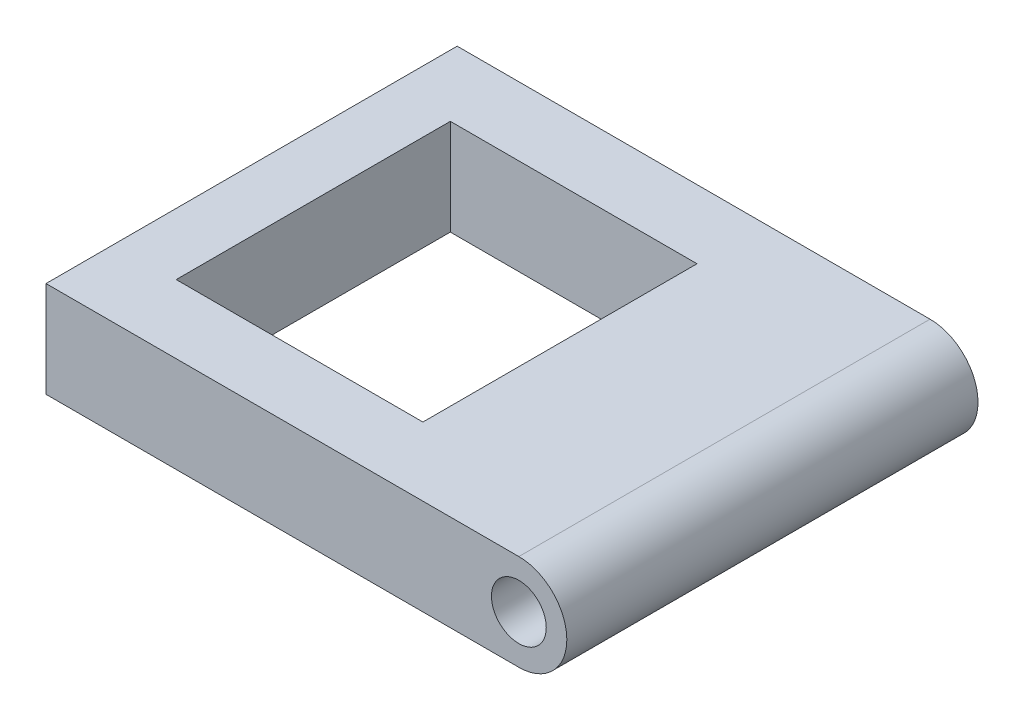
ISO-10303-21;
HEADER;
FILE_DESCRIPTION(('STEP AP214'),'2;1');
FILE_NAME('part.step','',(''),(''),'','','');
FILE_SCHEMA(('AUTOMOTIVE_DESIGN { 1 0 10303 214 1 1 1 1 }'));
ENDSEC;
DATA;
#1=APPLICATION_CONTEXT('core data for automotive mechanical design processes');
#2=APPLICATION_PROTOCOL_DEFINITION('international standard','automotive_design',2000,#1);
#3=PRODUCT_CONTEXT('',#1,'mechanical');
#4=PRODUCT('Part','Part','',(#3));
#5=PRODUCT_RELATED_PRODUCT_CATEGORY('part','',(#4));
#6=PRODUCT_DEFINITION_FORMATION('','',#4);
#7=PRODUCT_DEFINITION_CONTEXT('part definition',#1,'design');
#8=PRODUCT_DEFINITION('design','',#6,#7);
#9=PRODUCT_DEFINITION_SHAPE('','',#8);
#10=(LENGTH_UNIT() NAMED_UNIT(*) SI_UNIT(.MILLI.,.METRE.));
#11=(NAMED_UNIT(*) PLANE_ANGLE_UNIT() SI_UNIT($,.RADIAN.));
#12=(NAMED_UNIT(*) SI_UNIT($,.STERADIAN.) SOLID_ANGLE_UNIT());
#13=UNCERTAINTY_MEASURE_WITH_UNIT(LENGTH_MEASURE(1.E-05),#10,'distance_accuracy_value','');
#14=(GEOMETRIC_REPRESENTATION_CONTEXT(3) GLOBAL_UNCERTAINTY_ASSIGNED_CONTEXT((#13)) GLOBAL_UNIT_ASSIGNED_CONTEXT((#10,
#11,#12)) REPRESENTATION_CONTEXT('',''));
#15=CARTESIAN_POINT('',(0.,0.,0.));
#16=DIRECTION('',(0.,0.,1.));
#17=DIRECTION('',(1.,0.,0.));
#18=AXIS2_PLACEMENT_3D('',#15,#16,#17);
#19=CARTESIAN_POINT('',(0.,14.,0.));
#20=DIRECTION('',(0.,-1.,0.));
#21=DIRECTION('',(0.,0.,-1.));
#22=AXIS2_PLACEMENT_3D('',#19,#20,#21);
#23=PLANE('',#22);
#24=DIRECTION('',(0.,0.,1.));
#25=VECTOR('',#24,1.);
#26=CARTESIAN_POINT('',(0.,14.,0.));
#27=LINE('',#26,#25);
#28=CARTESIAN_POINT('',(0.,14.,-60.));
#29=VERTEX_POINT('',#28);
#30=CARTESIAN_POINT('',(0.,14.,0.));
#31=VERTEX_POINT('',#30);
#32=EDGE_CURVE('E126',#29,#31,#27,.T.);
#33=ORIENTED_EDGE('',*,*,#32,.T.);
#34=DIRECTION('',(1.,0.,0.));
#35=VECTOR('',#34,1.);
#36=CARTESIAN_POINT('',(0.,14.,0.));
#37=LINE('',#36,#35);
#38=CARTESIAN_POINT('',(69.,14.,0.));
#39=VERTEX_POINT('',#38);
#40=EDGE_CURVE('E194',#31,#39,#37,.T.);
#41=ORIENTED_EDGE('',*,*,#40,.T.);
#42=DIRECTION('',(0.,0.,1.));
#43=VECTOR('',#42,1.);
#44=CARTESIAN_POINT('',(69.,14.,-60.));
#45=LINE('',#44,#43);
#46=CARTESIAN_POINT('',(69.,14.,-60.));
#47=VERTEX_POINT('',#46);
#48=EDGE_CURVE('E137',#47,#39,#45,.T.);
#49=ORIENTED_EDGE('',*,*,#48,.F.);
#50=DIRECTION('',(-1.,0.,0.));
#51=VECTOR('',#50,1.);
#52=CARTESIAN_POINT('',(0.,14.,-60.));
#53=LINE('',#52,#51);
#54=EDGE_CURVE('E141',#47,#29,#53,.T.);
#55=ORIENTED_EDGE('',*,*,#54,.T.);
#56=EDGE_LOOP('',(#33,#41,#49,#55));
#57=FACE_BOUND('',#56,.T.);
#58=DIRECTION('',(1.,0.,0.));
#59=VECTOR('',#58,1.);
#60=CARTESIAN_POINT('',(45.,14.,-10.));
#61=LINE('',#60,#59);
#62=CARTESIAN_POINT('',(9.,14.,-10.));
#63=VERTEX_POINT('',#62);
#64=CARTESIAN_POINT('',(45.,14.,-10.));
#65=VERTEX_POINT('',#64);
#66=EDGE_CURVE('E154',#63,#65,#61,.T.);
#67=ORIENTED_EDGE('',*,*,#66,.F.);
#68=DIRECTION('',(0.,0.,1.));
#69=VECTOR('',#68,1.);
#70=CARTESIAN_POINT('',(9.,14.,-10.));
#71=LINE('',#70,#69);
#72=CARTESIAN_POINT('',(9.,14.,-50.));
#73=VERTEX_POINT('',#72);
#74=EDGE_CURVE('E164',#73,#63,#71,.T.);
#75=ORIENTED_EDGE('',*,*,#74,.F.);
#76=DIRECTION('',(-1.,0.,0.));
#77=VECTOR('',#76,1.);
#78=CARTESIAN_POINT('',(9.,14.,-50.));
#79=LINE('',#78,#77);
#80=CARTESIAN_POINT('',(45.,14.,-50.));
#81=VERTEX_POINT('',#80);
#82=EDGE_CURVE('E161',#81,#73,#79,.T.);
#83=ORIENTED_EDGE('',*,*,#82,.F.);
#84=DIRECTION('',(0.,0.,-1.));
#85=VECTOR('',#84,1.);
#86=CARTESIAN_POINT('',(45.,14.,-50.));
#87=LINE('',#86,#85);
#88=EDGE_CURVE('E157',#65,#81,#87,.T.);
#89=ORIENTED_EDGE('',*,*,#88,.F.);
#90=EDGE_LOOP('',(#67,#75,#83,#89));
#91=FACE_BOUND('',#90,.T.);
#92=ADVANCED_FACE('F45',(#57,#91),#23,.F.);
#93=CARTESIAN_POINT('',(0.,0.,0.));
#94=DIRECTION('',(0.,-1.,0.));
#95=DIRECTION('',(0.,0.,-1.));
#96=AXIS2_PLACEMENT_3D('',#93,#94,#95);
#97=PLANE('',#96);
#98=DIRECTION('',(0.,0.,1.));
#99=VECTOR('',#98,1.);
#100=CARTESIAN_POINT('',(0.,0.,0.));
#101=LINE('',#100,#99);
#102=CARTESIAN_POINT('',(0.,0.,-60.));
#103=VERTEX_POINT('',#102);
#104=CARTESIAN_POINT('',(0.,0.,0.));
#105=VERTEX_POINT('',#104);
#106=EDGE_CURVE('E120',#103,#105,#101,.T.);
#107=ORIENTED_EDGE('',*,*,#106,.F.);
#108=DIRECTION('',(-1.,0.,0.));
#109=VECTOR('',#108,1.);
#110=CARTESIAN_POINT('',(0.,0.,-60.));
#111=LINE('',#110,#109);
#112=CARTESIAN_POINT('',(69.,0.,-60.));
#113=VERTEX_POINT('',#112);
#114=EDGE_CURVE('E113',#113,#103,#111,.T.);
#115=ORIENTED_EDGE('',*,*,#114,.F.);
#116=DIRECTION('',(0.,0.,1.));
#117=VECTOR('',#116,1.);
#118=CARTESIAN_POINT('',(69.,0.,-60.));
#119=LINE('',#118,#117);
#120=CARTESIAN_POINT('',(69.,0.,0.));
#121=VERTEX_POINT('',#120);
#122=EDGE_CURVE('E117',#113,#121,#119,.T.);
#123=ORIENTED_EDGE('',*,*,#122,.T.);
#124=DIRECTION('',(1.,0.,0.));
#125=VECTOR('',#124,1.);
#126=CARTESIAN_POINT('',(0.,0.,0.));
#127=LINE('',#126,#125);
#128=EDGE_CURVE('E127',#105,#121,#127,.T.);
#129=ORIENTED_EDGE('',*,*,#128,.F.);
#130=EDGE_LOOP('',(#107,#115,#123,#129));
#131=FACE_BOUND('',#130,.T.);
#132=DIRECTION('',(0.,0.,1.));
#133=VECTOR('',#132,1.);
#134=CARTESIAN_POINT('',(9.,0.,-10.));
#135=LINE('',#134,#133);
#136=CARTESIAN_POINT('',(9.,0.,-50.));
#137=VERTEX_POINT('',#136);
#138=CARTESIAN_POINT('',(9.,0.,-10.));
#139=VERTEX_POINT('',#138);
#140=EDGE_CURVE('E158',#137,#139,#135,.T.);
#141=ORIENTED_EDGE('',*,*,#140,.T.);
#142=DIRECTION('',(1.,0.,0.));
#143=VECTOR('',#142,1.);
#144=CARTESIAN_POINT('',(45.,0.,-10.));
#145=LINE('',#144,#143);
#146=CARTESIAN_POINT('',(45.,0.,-10.));
#147=VERTEX_POINT('',#146);
#148=EDGE_CURVE('E69',#139,#147,#145,.T.);
#149=ORIENTED_EDGE('',*,*,#148,.T.);
#150=DIRECTION('',(0.,0.,-1.));
#151=VECTOR('',#150,1.);
#152=CARTESIAN_POINT('',(45.,0.,-50.));
#153=LINE('',#152,#151);
#154=CARTESIAN_POINT('',(45.,0.,-50.));
#155=VERTEX_POINT('',#154);
#156=EDGE_CURVE('E170',#147,#155,#153,.T.);
#157=ORIENTED_EDGE('',*,*,#156,.T.);
#158=DIRECTION('',(-1.,0.,0.));
#159=VECTOR('',#158,1.);
#160=CARTESIAN_POINT('',(9.,0.,-50.));
#161=LINE('',#160,#159);
#162=EDGE_CURVE('E174',#155,#137,#161,.T.);
#163=ORIENTED_EDGE('',*,*,#162,.T.);
#164=EDGE_LOOP('',(#141,#149,#157,#163));
#165=FACE_BOUND('',#164,.T.);
#166=ADVANCED_FACE('F115',(#131,#165),#97,.T.);
#167=CARTESIAN_POINT('',(0.,14.,0.));
#168=DIRECTION('',(1.,0.,0.));
#169=DIRECTION('',(0.,0.,-1.));
#170=AXIS2_PLACEMENT_3D('',#167,#168,#169);
#171=PLANE('',#170);
#172=ORIENTED_EDGE('',*,*,#106,.T.);
#173=DIRECTION('',(0.,-1.,0.));
#174=VECTOR('',#173,1.);
#175=CARTESIAN_POINT('',(0.,14.,0.));
#176=LINE('',#175,#174);
#177=EDGE_CURVE('E11',#31,#105,#176,.T.);
#178=ORIENTED_EDGE('',*,*,#177,.F.);
#179=ORIENTED_EDGE('',*,*,#32,.F.);
#180=DIRECTION('',(0.,-1.,0.));
#181=VECTOR('',#180,1.);
#182=CARTESIAN_POINT('',(0.,14.,-60.));
#183=LINE('',#182,#181);
#184=EDGE_CURVE('E54',#29,#103,#183,.T.);
#185=ORIENTED_EDGE('',*,*,#184,.T.);
#186=EDGE_LOOP('',(#172,#178,#179,#185));
#187=FACE_BOUND('',#186,.T.);
#188=ADVANCED_FACE('F47',(#187),#171,.F.);
#189=CARTESIAN_POINT('',(0.,14.,0.));
#190=DIRECTION('',(0.,0.,-1.));
#191=DIRECTION('',(-1.,0.,0.));
#192=AXIS2_PLACEMENT_3D('',#189,#190,#191);
#193=PLANE('',#192);
#194=ORIENTED_EDGE('',*,*,#128,.T.);
#195=CARTESIAN_POINT('',(69.,7.,0.));
#196=DIRECTION('',(0.,0.,1.));
#197=DIRECTION('',(1.,0.,0.));
#198=AXIS2_PLACEMENT_3D('',#195,#196,#197);
#199=CIRCLE('',#198,7.);
#200=EDGE_CURVE('E135',#121,#39,#199,.T.);
#201=ORIENTED_EDGE('',*,*,#200,.T.);
#202=ORIENTED_EDGE('',*,*,#40,.F.);
#203=ORIENTED_EDGE('',*,*,#177,.T.);
#204=EDGE_LOOP('',(#194,#201,#202,#203));
#205=FACE_BOUND('',#204,.T.);
#206=CARTESIAN_POINT('',(69.,7.,0.));
#207=DIRECTION('',(0.,0.,1.));
#208=DIRECTION('',(1.,0.,0.));
#209=AXIS2_PLACEMENT_3D('',#206,#207,#208);
#210=CIRCLE('',#209,4.00000000000001);
#211=CARTESIAN_POINT('',(73.,7.,0.));
#212=VERTEX_POINT('',#211);
#213=EDGE_CURVE('E149',#212,#212,#210,.T.);
#214=ORIENTED_EDGE('',*,*,#213,.F.);
#215=EDGE_LOOP('',(#214));
#216=FACE_BOUND('',#215,.T.);
#217=ADVANCED_FACE('F209',(#205,#216),#193,.F.);
#218=CARTESIAN_POINT('',(0.,14.,-60.));
#219=DIRECTION('',(0.,0.,1.));
#220=DIRECTION('',(1.,0.,0.));
#221=AXIS2_PLACEMENT_3D('',#218,#219,#220);
#222=PLANE('',#221);
#223=ORIENTED_EDGE('',*,*,#114,.T.);
#224=ORIENTED_EDGE('',*,*,#184,.F.);
#225=ORIENTED_EDGE('',*,*,#54,.F.);
#226=CARTESIAN_POINT('',(69.,7.,-60.));
#227=DIRECTION('',(0.,0.,1.));
#228=DIRECTION('',(1.,0.,0.));
#229=AXIS2_PLACEMENT_3D('',#226,#227,#228);
#230=CIRCLE('',#229,7.);
#231=EDGE_CURVE('E133',#113,#47,#230,.T.);
#232=ORIENTED_EDGE('',*,*,#231,.F.);
#233=EDGE_LOOP('',(#223,#224,#225,#232));
#234=FACE_BOUND('',#233,.T.);
#235=CARTESIAN_POINT('',(69.,7.,-60.));
#236=DIRECTION('',(0.,0.,1.));
#237=DIRECTION('',(1.,0.,0.));
#238=AXIS2_PLACEMENT_3D('',#235,#236,#237);
#239=CIRCLE('',#238,4.00000000000001);
#240=CARTESIAN_POINT('',(73.,7.,-60.));
#241=VERTEX_POINT('',#240);
#242=EDGE_CURVE('E146',#241,#241,#239,.T.);
#243=ORIENTED_EDGE('',*,*,#242,.T.);
#244=EDGE_LOOP('',(#243));
#245=FACE_BOUND('',#244,.T.);
#246=ADVANCED_FACE('F139',(#234,#245),#222,.F.);
#247=CARTESIAN_POINT('',(45.,14.,-10.));
#248=DIRECTION('',(0.,0.,-1.));
#249=DIRECTION('',(-1.,0.,0.));
#250=AXIS2_PLACEMENT_3D('',#247,#248,#249);
#251=PLANE('',#250);
#252=ORIENTED_EDGE('',*,*,#148,.F.);
#253=DIRECTION('',(0.,-1.,0.));
#254=VECTOR('',#253,1.);
#255=CARTESIAN_POINT('',(9.,14.,-10.));
#256=LINE('',#255,#254);
#257=EDGE_CURVE('E167',#63,#139,#256,.T.);
#258=ORIENTED_EDGE('',*,*,#257,.F.);
#259=ORIENTED_EDGE('',*,*,#66,.T.);
#260=DIRECTION('',(0.,-1.,0.));
#261=VECTOR('',#260,1.);
#262=CARTESIAN_POINT('',(45.,14.,-10.));
#263=LINE('',#262,#261);
#264=EDGE_CURVE('E188',#65,#147,#263,.T.);
#265=ORIENTED_EDGE('',*,*,#264,.T.);
#266=EDGE_LOOP('',(#252,#258,#259,#265));
#267=FACE_BOUND('',#266,.T.);
#268=ADVANCED_FACE('F236',(#267),#251,.T.);
#269=CARTESIAN_POINT('',(45.,14.,-50.));
#270=DIRECTION('',(-1.,0.,0.));
#271=DIRECTION('',(0.,0.,1.));
#272=AXIS2_PLACEMENT_3D('',#269,#270,#271);
#273=PLANE('',#272);
#274=ORIENTED_EDGE('',*,*,#156,.F.);
#275=ORIENTED_EDGE('',*,*,#264,.F.);
#276=ORIENTED_EDGE('',*,*,#88,.T.);
#277=DIRECTION('',(0.,-1.,0.));
#278=VECTOR('',#277,1.);
#279=CARTESIAN_POINT('',(45.,14.,-50.));
#280=LINE('',#279,#278);
#281=EDGE_CURVE('E185',#81,#155,#280,.T.);
#282=ORIENTED_EDGE('',*,*,#281,.T.);
#283=EDGE_LOOP('',(#274,#275,#276,#282));
#284=FACE_BOUND('',#283,.T.);
#285=ADVANCED_FACE('F243',(#284),#273,.T.);
#286=CARTESIAN_POINT('',(9.,14.,-50.));
#287=DIRECTION('',(0.,0.,1.));
#288=DIRECTION('',(1.,0.,0.));
#289=AXIS2_PLACEMENT_3D('',#286,#287,#288);
#290=PLANE('',#289);
#291=ORIENTED_EDGE('',*,*,#162,.F.);
#292=ORIENTED_EDGE('',*,*,#281,.F.);
#293=ORIENTED_EDGE('',*,*,#82,.T.);
#294=DIRECTION('',(0.,-1.,0.));
#295=VECTOR('',#294,1.);
#296=CARTESIAN_POINT('',(9.,14.,-50.));
#297=LINE('',#296,#295);
#298=EDGE_CURVE('E61',#73,#137,#297,.T.);
#299=ORIENTED_EDGE('',*,*,#298,.T.);
#300=EDGE_LOOP('',(#291,#292,#293,#299));
#301=FACE_BOUND('',#300,.T.);
#302=ADVANCED_FACE('F248',(#301),#290,.T.);
#303=CARTESIAN_POINT('',(9.,14.,-10.));
#304=DIRECTION('',(1.,0.,0.));
#305=DIRECTION('',(0.,0.,-1.));
#306=AXIS2_PLACEMENT_3D('',#303,#304,#305);
#307=PLANE('',#306);
#308=ORIENTED_EDGE('',*,*,#140,.F.);
#309=ORIENTED_EDGE('',*,*,#298,.F.);
#310=ORIENTED_EDGE('',*,*,#74,.T.);
#311=ORIENTED_EDGE('',*,*,#257,.T.);
#312=EDGE_LOOP('',(#308,#309,#310,#311));
#313=FACE_BOUND('',#312,.T.);
#314=ADVANCED_FACE('F226',(#313),#307,.T.);
#315=CARTESIAN_POINT('',(69.,7.,-60.));
#316=DIRECTION('',(0.,0.,1.));
#317=DIRECTION('',(1.,0.,0.));
#318=AXIS2_PLACEMENT_3D('',#315,#316,#317);
#319=CYLINDRICAL_SURFACE('',#318,7.);
#320=ORIENTED_EDGE('',*,*,#200,.F.);
#321=ORIENTED_EDGE('',*,*,#122,.F.);
#322=ORIENTED_EDGE('',*,*,#231,.T.);
#323=ORIENTED_EDGE('',*,*,#48,.T.);
#324=EDGE_LOOP('',(#320,#321,#322,#323));
#325=FACE_BOUND('',#324,.T.);
#326=ADVANCED_FACE('F131',(#325),#319,.T.);
#327=CARTESIAN_POINT('',(69.,7.,-60.));
#328=DIRECTION('',(0.,0.,1.));
#329=DIRECTION('',(1.,0.,0.));
#330=AXIS2_PLACEMENT_3D('',#327,#328,#329);
#331=CYLINDRICAL_SURFACE('',#330,4.00000000000001);
#332=ORIENTED_EDGE('',*,*,#242,.F.);
#333=EDGE_LOOP('',(#332));
#334=FACE_BOUND('',#333,.T.);
#335=ORIENTED_EDGE('',*,*,#213,.T.);
#336=EDGE_LOOP('',(#335));
#337=FACE_BOUND('',#336,.T.);
#338=ADVANCED_FACE('F220',(#334,#337),#331,.F.);
#339=CLOSED_SHELL('',(#92,#166,#188,#217,#246,#268,#285,#302,#314,#326,#338));
#340=MANIFOLD_SOLID_BREP('B2',#339);
#341=ADVANCED_BREP_SHAPE_REPRESENTATION('',(#18,#340),#14);
#342=SHAPE_DEFINITION_REPRESENTATION(#9,#341);
ENDSEC;
END-ISO-10303-21;
